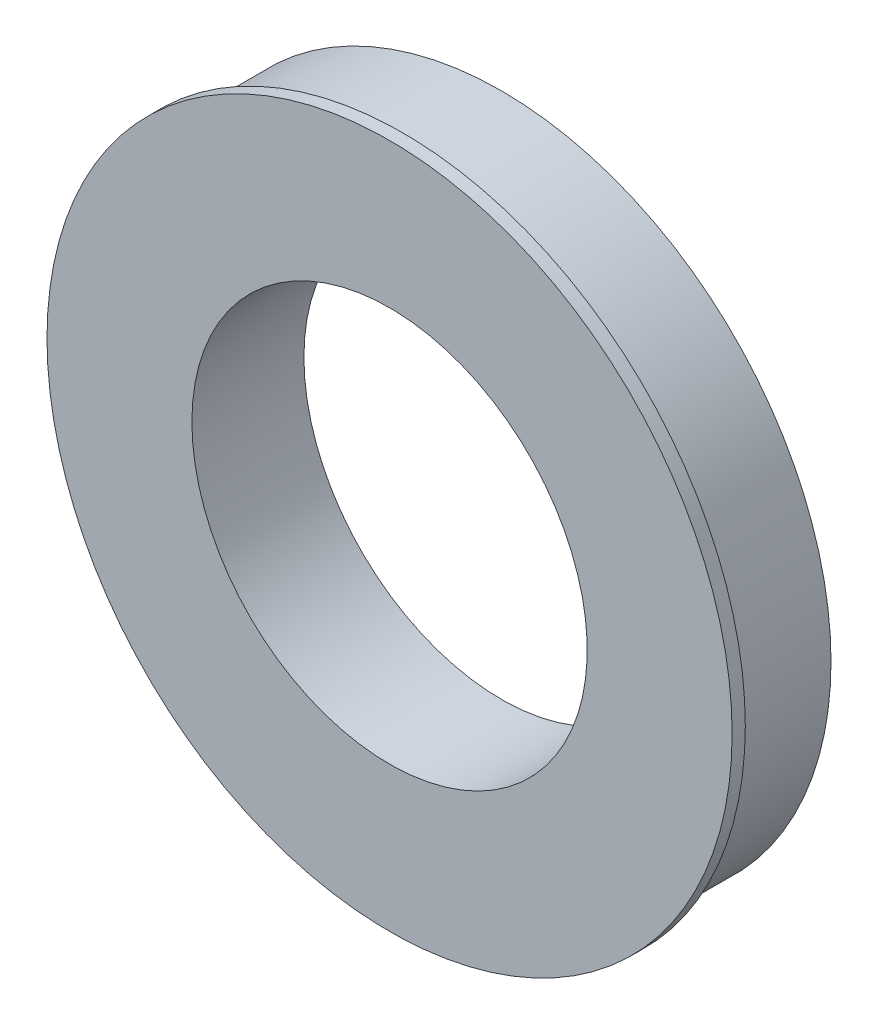
ISO-10303-21;
HEADER;
FILE_DESCRIPTION(('STEP AP214'),'2;1');
FILE_NAME('part.step','',(''),(''),'','','');
FILE_SCHEMA(('AUTOMOTIVE_DESIGN { 1 0 10303 214 1 1 1 1 }'));
ENDSEC;
DATA;
#1=APPLICATION_CONTEXT('core data for automotive mechanical design processes');
#2=APPLICATION_PROTOCOL_DEFINITION('international standard','automotive_design',2000,#1);
#3=PRODUCT_CONTEXT('',#1,'mechanical');
#4=PRODUCT('Part','Part','',(#3));
#5=PRODUCT_RELATED_PRODUCT_CATEGORY('part','',(#4));
#6=PRODUCT_DEFINITION_FORMATION('','',#4);
#7=PRODUCT_DEFINITION_CONTEXT('part definition',#1,'design');
#8=PRODUCT_DEFINITION('design','',#6,#7);
#9=PRODUCT_DEFINITION_SHAPE('','',#8);
#10=(LENGTH_UNIT() NAMED_UNIT(*) SI_UNIT(.MILLI.,.METRE.));
#11=(NAMED_UNIT(*) PLANE_ANGLE_UNIT() SI_UNIT($,.RADIAN.));
#12=(NAMED_UNIT(*) SI_UNIT($,.STERADIAN.) SOLID_ANGLE_UNIT());
#13=UNCERTAINTY_MEASURE_WITH_UNIT(LENGTH_MEASURE(1.E-05),#10,'distance_accuracy_value','');
#14=(GEOMETRIC_REPRESENTATION_CONTEXT(3) GLOBAL_UNCERTAINTY_ASSIGNED_CONTEXT((#13)) GLOBAL_UNIT_ASSIGNED_CONTEXT((#10,
#11,#12)) REPRESENTATION_CONTEXT('',''));
#15=CARTESIAN_POINT('',(0.,0.,0.));
#16=DIRECTION('',(0.,0.,1.));
#17=DIRECTION('',(1.,0.,0.));
#18=AXIS2_PLACEMENT_3D('',#15,#16,#17);
#19=CARTESIAN_POINT('',(0.,0.,0.));
#20=DIRECTION('',(0.,0.,1.));
#21=DIRECTION('',(1.,0.,0.));
#22=AXIS2_PLACEMENT_3D('',#19,#20,#21);
#23=PLANE('',#22);
#24=CARTESIAN_POINT('',(0.,0.,0.));
#25=DIRECTION('',(0.,0.,1.));
#26=DIRECTION('',(1.,0.,0.));
#27=AXIS2_PLACEMENT_3D('',#24,#25,#26);
#28=CIRCLE('',#27,63.5);
#29=CARTESIAN_POINT('',(-63.5,0.,0.));
#30=VERTEX_POINT('',#29);
#31=EDGE_CURVE('E35',#30,#30,#28,.T.);
#32=ORIENTED_EDGE('',*,*,#31,.F.);
#33=EDGE_LOOP('',(#32));
#34=FACE_BOUND('',#33,.T.);
#35=CARTESIAN_POINT('',(0.,0.,0.));
#36=DIRECTION('',(0.,0.,1.));
#37=DIRECTION('',(1.,0.,0.));
#38=AXIS2_PLACEMENT_3D('',#35,#36,#37);
#39=CIRCLE('',#38,38.1);
#40=CARTESIAN_POINT('',(-38.1,0.,0.));
#41=VERTEX_POINT('',#40);
#42=EDGE_CURVE('E42',#41,#41,#39,.T.);
#43=ORIENTED_EDGE('',*,*,#42,.T.);
#44=EDGE_LOOP('',(#43));
#45=FACE_BOUND('',#44,.T.);
#46=ADVANCED_FACE('F31',(#34,#45),#23,.F.);
#47=CARTESIAN_POINT('',(0.,0.,19.05));
#48=DIRECTION('',(0.,0.,-1.));
#49=DIRECTION('',(-1.,0.,0.));
#50=AXIS2_PLACEMENT_3D('',#47,#48,#49);
#51=CYLINDRICAL_SURFACE('',#50,63.5);
#52=CARTESIAN_POINT('',(0.,0.,19.05));
#53=DIRECTION('',(0.,0.,1.));
#54=DIRECTION('',(1.,0.,0.));
#55=AXIS2_PLACEMENT_3D('',#52,#53,#54);
#56=CIRCLE('',#55,63.5);
#57=CARTESIAN_POINT('',(-63.5,0.,19.05));
#58=VERTEX_POINT('',#57);
#59=EDGE_CURVE('E10',#58,#58,#56,.T.);
#60=CARTESIAN_POINT('',(-63.5,0.,19.05));
#61=CARTESIAN_POINT('',(-63.5,0.,18.8515625));
#62=CARTESIAN_POINT('',(-63.5,0.,18.653125));
#63=CARTESIAN_POINT('',(-63.5,0.,18.25625));
#64=CARTESIAN_POINT('',(-63.5,0.,18.0578125));
#65=CARTESIAN_POINT('',(-63.5,0.,17.6609375));
#66=CARTESIAN_POINT('',(-63.5,0.,17.4625));
#67=CARTESIAN_POINT('',(-63.5,0.,17.065625));
#68=CARTESIAN_POINT('',(-63.5,0.,16.8671875));
#69=CARTESIAN_POINT('',(-63.5,0.,16.4703125));
#70=CARTESIAN_POINT('',(-63.5,0.,16.271875));
#71=CARTESIAN_POINT('',(-63.5,0.,15.875));
#72=CARTESIAN_POINT('',(-63.5,0.,15.6765625));
#73=CARTESIAN_POINT('',(-63.5,0.,15.2796875));
#74=CARTESIAN_POINT('',(-63.5,0.,15.08125));
#75=CARTESIAN_POINT('',(-63.5,0.,14.684375));
#76=CARTESIAN_POINT('',(-63.5,0.,14.4859375));
#77=CARTESIAN_POINT('',(-63.5,0.,14.0890625));
#78=CARTESIAN_POINT('',(-63.5,0.,13.890625));
#79=CARTESIAN_POINT('',(-63.5,0.,13.49375));
#80=CARTESIAN_POINT('',(-63.5,0.,13.2953125));
#81=CARTESIAN_POINT('',(-63.5,0.,12.8984375));
#82=CARTESIAN_POINT('',(-63.5,0.,12.7));
#83=CARTESIAN_POINT('',(-63.5,0.,12.303125));
#84=CARTESIAN_POINT('',(-63.5,0.,12.1046875));
#85=CARTESIAN_POINT('',(-63.5,0.,11.7078125));
#86=CARTESIAN_POINT('',(-63.5,0.,11.509375));
#87=CARTESIAN_POINT('',(-63.5,0.,11.1125));
#88=CARTESIAN_POINT('',(-63.5,0.,10.9140625));
#89=CARTESIAN_POINT('',(-63.5,0.,10.5171875));
#90=CARTESIAN_POINT('',(-63.5,0.,10.31875));
#91=CARTESIAN_POINT('',(-63.5,0.,9.921875));
#92=CARTESIAN_POINT('',(-63.5,0.,9.7234375));
#93=CARTESIAN_POINT('',(-63.5,0.,9.3265625));
#94=CARTESIAN_POINT('',(-63.5,0.,9.128125));
#95=CARTESIAN_POINT('',(-63.5,0.,8.73125));
#96=CARTESIAN_POINT('',(-63.5,0.,8.5328125));
#97=CARTESIAN_POINT('',(-63.5,0.,8.1359375));
#98=CARTESIAN_POINT('',(-63.5,0.,7.9375));
#99=CARTESIAN_POINT('',(-63.5,0.,7.540625));
#100=CARTESIAN_POINT('',(-63.5,0.,7.3421875));
#101=CARTESIAN_POINT('',(-63.5,0.,6.9453125));
#102=CARTESIAN_POINT('',(-63.5,0.,6.746875));
#103=CARTESIAN_POINT('',(-63.5,0.,6.35));
#104=CARTESIAN_POINT('',(-63.5,0.,6.1515625));
#105=CARTESIAN_POINT('',(-63.5,0.,5.7546875));
#106=CARTESIAN_POINT('',(-63.5,0.,5.55625));
#107=CARTESIAN_POINT('',(-63.5,0.,5.159375));
#108=CARTESIAN_POINT('',(-63.5,0.,4.9609375));
#109=CARTESIAN_POINT('',(-63.5,0.,4.5640625));
#110=CARTESIAN_POINT('',(-63.5,0.,4.365625));
#111=CARTESIAN_POINT('',(-63.5,0.,3.96875));
#112=CARTESIAN_POINT('',(-63.5,0.,3.7703125));
#113=CARTESIAN_POINT('',(-63.5,0.,3.3734375));
#114=CARTESIAN_POINT('',(-63.5,0.,3.175));
#115=CARTESIAN_POINT('',(-63.5,0.,2.778125));
#116=CARTESIAN_POINT('',(-63.5,0.,2.5796875));
#117=CARTESIAN_POINT('',(-63.5,0.,2.1828125));
#118=CARTESIAN_POINT('',(-63.5,0.,1.984375));
#119=CARTESIAN_POINT('',(-63.5,0.,1.5875));
#120=CARTESIAN_POINT('',(-63.5,0.,1.3890625));
#121=CARTESIAN_POINT('',(-63.5,0.,0.992187500000001));
#122=CARTESIAN_POINT('',(-63.5,0.,0.793750000000001));
#123=CARTESIAN_POINT('',(-63.5,0.,0.396875));
#124=CARTESIAN_POINT('',(-63.5,0.,0.1984375));
#125=CARTESIAN_POINT('',(-63.5,0.,0.));
#126=B_SPLINE_CURVE_WITH_KNOTS('',3,(#60,#61,#62,#63,#64,#65,#66,#67,#68,#69,#70,#71,#72,#73,
#74,#75,#76,#77,#78,#79,#80,#81,#82,#83,#84,#85,#86,#87,#88,#89,#90,#91,#92,#93,#94,#95,#96,#97,
#98,#99,#100,#101,#102,#103,#104,#105,#106,#107,#108,#109,#110,#111,#112,#113,#114,#115,#116,
#117,#118,#119,#120,#121,#122,#123,#124,#125),.UNSPECIFIED.,.F.,.F.,(4,2,2,2,2,2,2,2,2,2,2,2,2,
2,2,2,2,2,2,2,2,2,2,2,2,2,2,2,2,2,2,2,4),(0.,0.5953125,1.190625,1.7859375,2.38125,2.9765625,
3.571875,4.1671875,4.7625,5.3578125,5.953125,6.5484375,7.14375,7.7390625,8.334375,8.9296875,
9.525,10.1203125,10.715625,11.3109375,11.90625,12.5015625,13.096875,13.6921875,14.2875,
14.8828125,15.478125,16.0734375,16.66875,17.2640625,17.859375,18.4546875,19.05),.UNSPECIFIED.);
#127=EDGE_CURVE('BSEAM33',#58,#30,#126,.T.);
#128=ORIENTED_EDGE('',*,*,#59,.F.);
#129=ORIENTED_EDGE('',*,*,#31,.T.);
#130=ORIENTED_EDGE('',*,*,#127,.T.);
#131=ORIENTED_EDGE('',*,*,#127,.F.);
#132=EDGE_LOOP('',(#128,#130,#129,#131));
#133=FACE_BOUND('',#132,.T.);
#134=ADVANCED_FACE('F33',(#133),#51,.T.);
#135=CARTESIAN_POINT('',(0.,0.,19.05));
#136=DIRECTION('',(0.,0.,-1.));
#137=DIRECTION('',(-1.,0.,0.));
#138=AXIS2_PLACEMENT_3D('',#135,#136,#137);
#139=CYLINDRICAL_SURFACE('',#138,38.1);
#140=CARTESIAN_POINT('',(0.,0.,21.59));
#141=DIRECTION('',(0.,0.,1.));
#142=DIRECTION('',(1.,0.,0.));
#143=AXIS2_PLACEMENT_3D('',#140,#141,#142);
#144=CIRCLE('',#143,38.1);
#145=CARTESIAN_POINT('',(-38.1,0.,21.59));
#146=VERTEX_POINT('',#145);
#147=EDGE_CURVE('E50',#146,#146,#144,.T.);
#148=CARTESIAN_POINT('',(-38.1,0.,0.));
#149=CARTESIAN_POINT('',(-38.1,0.,0.224895833333333));
#150=CARTESIAN_POINT('',(-38.1,0.,0.449791666666667));
#151=CARTESIAN_POINT('',(-38.1,0.,0.899583333333333));
#152=CARTESIAN_POINT('',(-38.1,0.,1.12447916666667));
#153=CARTESIAN_POINT('',(-38.1,0.,1.57427083333333));
#154=CARTESIAN_POINT('',(-38.1,0.,1.79916666666667));
#155=CARTESIAN_POINT('',(-38.1,0.,2.24895833333333));
#156=CARTESIAN_POINT('',(-38.1,0.,2.47385416666667));
#157=CARTESIAN_POINT('',(-38.1,0.,2.92364583333333));
#158=CARTESIAN_POINT('',(-38.1,0.,3.14854166666667));
#159=CARTESIAN_POINT('',(-38.1,0.,3.59833333333333));
#160=CARTESIAN_POINT('',(-38.1,0.,3.82322916666667));
#161=CARTESIAN_POINT('',(-38.1,0.,4.27302083333333));
#162=CARTESIAN_POINT('',(-38.1,0.,4.49791666666667));
#163=CARTESIAN_POINT('',(-38.1,0.,4.94770833333333));
#164=CARTESIAN_POINT('',(-38.1,0.,5.17260416666667));
#165=CARTESIAN_POINT('',(-38.1,0.,5.62239583333333));
#166=CARTESIAN_POINT('',(-38.1,0.,5.84729166666667));
#167=CARTESIAN_POINT('',(-38.1,0.,6.29708333333333));
#168=CARTESIAN_POINT('',(-38.1,0.,6.52197916666667));
#169=CARTESIAN_POINT('',(-38.1,0.,6.97177083333333));
#170=CARTESIAN_POINT('',(-38.1,0.,7.19666666666667));
#171=CARTESIAN_POINT('',(-38.1,0.,7.64645833333333));
#172=CARTESIAN_POINT('',(-38.1,0.,7.87135416666667));
#173=CARTESIAN_POINT('',(-38.1,0.,8.32114583333333));
#174=CARTESIAN_POINT('',(-38.1,0.,8.54604166666667));
#175=CARTESIAN_POINT('',(-38.1,0.,8.99583333333334));
#176=CARTESIAN_POINT('',(-38.1,0.,9.22072916666667));
#177=CARTESIAN_POINT('',(-38.1,0.,9.67052083333333));
#178=CARTESIAN_POINT('',(-38.1,0.,9.89541666666667));
#179=CARTESIAN_POINT('',(-38.1,0.,10.3452083333333));
#180=CARTESIAN_POINT('',(-38.1,0.,10.5701041666667));
#181=CARTESIAN_POINT('',(-38.1,0.,11.0198958333333));
#182=CARTESIAN_POINT('',(-38.1,0.,11.2447916666667));
#183=CARTESIAN_POINT('',(-38.1,0.,11.6945833333333));
#184=CARTESIAN_POINT('',(-38.1,0.,11.9194791666667));
#185=CARTESIAN_POINT('',(-38.1,0.,12.3692708333333));
#186=CARTESIAN_POINT('',(-38.1,0.,12.5941666666667));
#187=CARTESIAN_POINT('',(-38.1,0.,13.0439583333333));
#188=CARTESIAN_POINT('',(-38.1,0.,13.2688541666667));
#189=CARTESIAN_POINT('',(-38.1,0.,13.7186458333333));
#190=CARTESIAN_POINT('',(-38.1,0.,13.9435416666667));
#191=CARTESIAN_POINT('',(-38.1,0.,14.3933333333333));
#192=CARTESIAN_POINT('',(-38.1,0.,14.6182291666667));
#193=CARTESIAN_POINT('',(-38.1,0.,15.0680208333333));
#194=CARTESIAN_POINT('',(-38.1,0.,15.2929166666667));
#195=CARTESIAN_POINT('',(-38.1,0.,15.7427083333333));
#196=CARTESIAN_POINT('',(-38.1,0.,15.9676041666667));
#197=CARTESIAN_POINT('',(-38.1,0.,16.4173958333333));
#198=CARTESIAN_POINT('',(-38.1,0.,16.6422916666667));
#199=CARTESIAN_POINT('',(-38.1,0.,17.0920833333333));
#200=CARTESIAN_POINT('',(-38.1,0.,17.3169791666667));
#201=CARTESIAN_POINT('',(-38.1,0.,17.7667708333333));
#202=CARTESIAN_POINT('',(-38.1,0.,17.9916666666667));
#203=CARTESIAN_POINT('',(-38.1,0.,18.4414583333333));
#204=CARTESIAN_POINT('',(-38.1,0.,18.6663541666667));
#205=CARTESIAN_POINT('',(-38.1,0.,19.1161458333333));
#206=CARTESIAN_POINT('',(-38.1,0.,19.3410416666667));
#207=CARTESIAN_POINT('',(-38.1,0.,19.7908333333333));
#208=CARTESIAN_POINT('',(-38.1,0.,20.0157291666667));
#209=CARTESIAN_POINT('',(-38.1,0.,20.4655208333333));
#210=CARTESIAN_POINT('',(-38.1,0.,20.6904166666667));
#211=CARTESIAN_POINT('',(-38.1,0.,21.1402083333333));
#212=CARTESIAN_POINT('',(-38.1,0.,21.3651041666667));
#213=CARTESIAN_POINT('',(-38.1,0.,21.59));
#214=B_SPLINE_CURVE_WITH_KNOTS('',3,(#148,#149,#150,#151,#152,#153,#154,#155,#156,#157,#158,
#159,#160,#161,#162,#163,#164,#165,#166,#167,#168,#169,#170,#171,#172,#173,#174,#175,#176,#177,
#178,#179,#180,#181,#182,#183,#184,#185,#186,#187,#188,#189,#190,#191,#192,#193,#194,#195,#196,
#197,#198,#199,#200,#201,#202,#203,#204,#205,#206,#207,#208,#209,#210,#211,#212,#213),
.UNSPECIFIED.,.F.,.F.,(4,2,2,2,2,2,2,2,2,2,2,2,2,2,2,2,2,2,2,2,2,2,2,2,2,2,2,2,2,2,2,2,4),(0.,
0.6746875,1.349375,2.0240625,2.69875,3.3734375,4.048125,4.7228125,5.3975,6.0721875,6.746875,
7.4215625,8.09625,8.7709375,9.445625,10.1203125,10.795,11.4696875,12.144375,12.8190625,13.49375,
14.1684375,14.843125,15.5178125,16.1925,16.8671875,17.541875,18.2165625,18.89125,19.5659375,
20.240625,20.9153125,21.59),.UNSPECIFIED.);
#215=EDGE_CURVE('BSEAM56',#41,#146,#214,.T.);
#216=ORIENTED_EDGE('',*,*,#42,.F.);
#217=ORIENTED_EDGE('',*,*,#147,.T.);
#218=ORIENTED_EDGE('',*,*,#215,.T.);
#219=ORIENTED_EDGE('',*,*,#215,.F.);
#220=EDGE_LOOP('',(#216,#218,#217,#219));
#221=FACE_BOUND('',#220,.T.);
#222=ADVANCED_FACE('F56',(#221),#139,.F.);
#223=CARTESIAN_POINT('',(0.,0.,21.59));
#224=DIRECTION('',(0.,0.,1.));
#225=DIRECTION('',(1.,0.,0.));
#226=AXIS2_PLACEMENT_3D('',#223,#224,#225);
#227=PLANE('',#226);
#228=CARTESIAN_POINT('',(0.,0.,21.59));
#229=DIRECTION('',(0.,0.,1.));
#230=DIRECTION('',(1.,0.,0.));
#231=AXIS2_PLACEMENT_3D('',#228,#229,#230);
#232=CIRCLE('',#231,66.03);
#233=CARTESIAN_POINT('',(66.03,0.,21.59));
#234=VERTEX_POINT('',#233);
#235=EDGE_CURVE('E46',#234,#234,#232,.T.);
#236=ORIENTED_EDGE('',*,*,#235,.T.);
#237=EDGE_LOOP('',(#236));
#238=FACE_BOUND('',#237,.T.);
#239=ORIENTED_EDGE('',*,*,#147,.F.);
#240=EDGE_LOOP('',(#239));
#241=FACE_BOUND('',#240,.T.);
#242=ADVANCED_FACE('F58',(#238,#241),#227,.T.);
#243=CARTESIAN_POINT('',(0.,0.,19.05));
#244=DIRECTION('',(0.,0.,1.));
#245=DIRECTION('',(1.,0.,0.));
#246=AXIS2_PLACEMENT_3D('',#243,#244,#245);
#247=PLANE('',#246);
#248=ORIENTED_EDGE('',*,*,#59,.T.);
#249=EDGE_LOOP('',(#248));
#250=FACE_BOUND('',#249,.T.);
#251=CARTESIAN_POINT('',(0.,0.,19.05));
#252=DIRECTION('',(0.,0.,1.));
#253=DIRECTION('',(1.,0.,0.));
#254=AXIS2_PLACEMENT_3D('',#251,#252,#253);
#255=CIRCLE('',#254,66.03);
#256=CARTESIAN_POINT('',(66.03,0.,19.05));
#257=VERTEX_POINT('',#256);
#258=EDGE_CURVE('E47',#257,#257,#255,.T.);
#259=ORIENTED_EDGE('',*,*,#258,.F.);
#260=EDGE_LOOP('',(#259));
#261=FACE_BOUND('',#260,.T.);
#262=ADVANCED_FACE('F60',(#250,#261),#247,.F.);
#263=CARTESIAN_POINT('',(0.,0.,21.59));
#264=DIRECTION('',(0.,0.,-1.));
#265=DIRECTION('',(-1.,0.,0.));
#266=AXIS2_PLACEMENT_3D('',#263,#264,#265);
#267=CYLINDRICAL_SURFACE('',#266,66.03);
#268=ORIENTED_EDGE('',*,*,#235,.F.);
#269=EDGE_LOOP('',(#268));
#270=FACE_BOUND('',#269,.T.);
#271=ORIENTED_EDGE('',*,*,#258,.T.);
#272=EDGE_LOOP('',(#271));
#273=FACE_BOUND('',#272,.T.);
#274=ADVANCED_FACE('F67',(#270,#273),#267,.T.);
#275=CLOSED_SHELL('',(#46,#134,#222,#242,#262,#274));
#276=MANIFOLD_SOLID_BREP('B2',#275);
#277=ADVANCED_BREP_SHAPE_REPRESENTATION('',(#18,#276),#14);
#278=SHAPE_DEFINITION_REPRESENTATION(#9,#277);
ENDSEC;
END-ISO-10303-21;
